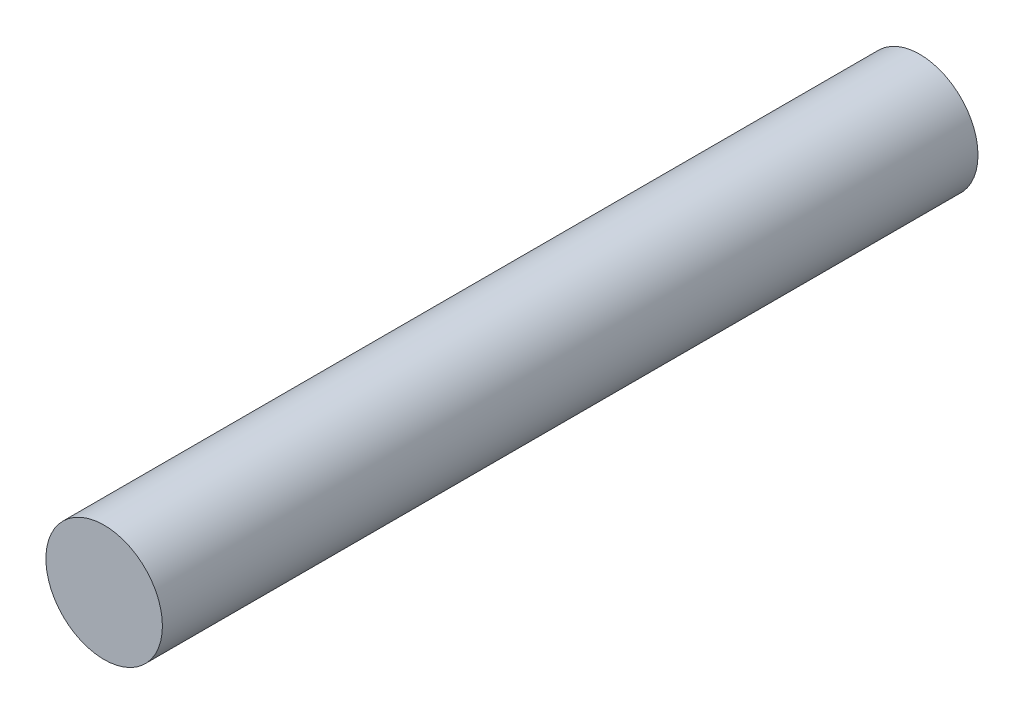
ISO-10303-21;
HEADER;
FILE_DESCRIPTION(('STEP AP214'),'2;1');
FILE_NAME('part.step','',(''),(''),'','','');
FILE_SCHEMA(('AUTOMOTIVE_DESIGN { 1 0 10303 214 1 1 1 1 }'));
ENDSEC;
DATA;
#1=APPLICATION_CONTEXT('core data for automotive mechanical design processes');
#2=APPLICATION_PROTOCOL_DEFINITION('international standard','automotive_design',2000,#1);
#3=PRODUCT_CONTEXT('',#1,'mechanical');
#4=PRODUCT('Part','Part','',(#3));
#5=PRODUCT_RELATED_PRODUCT_CATEGORY('part','',(#4));
#6=PRODUCT_DEFINITION_FORMATION('','',#4);
#7=PRODUCT_DEFINITION_CONTEXT('part definition',#1,'design');
#8=PRODUCT_DEFINITION('design','',#6,#7);
#9=PRODUCT_DEFINITION_SHAPE('','',#8);
#10=(LENGTH_UNIT() NAMED_UNIT(*) SI_UNIT(.MILLI.,.METRE.));
#11=(NAMED_UNIT(*) PLANE_ANGLE_UNIT() SI_UNIT($,.RADIAN.));
#12=(NAMED_UNIT(*) SI_UNIT($,.STERADIAN.) SOLID_ANGLE_UNIT());
#13=UNCERTAINTY_MEASURE_WITH_UNIT(LENGTH_MEASURE(1.E-05),#10,'distance_accuracy_value','');
#14=(GEOMETRIC_REPRESENTATION_CONTEXT(3) GLOBAL_UNCERTAINTY_ASSIGNED_CONTEXT((#13)) GLOBAL_UNIT_ASSIGNED_CONTEXT((#10,
#11,#12)) REPRESENTATION_CONTEXT('',''));
#15=CARTESIAN_POINT('',(0.,0.,0.));
#16=DIRECTION('',(0.,0.,1.));
#17=DIRECTION('',(1.,0.,0.));
#18=AXIS2_PLACEMENT_3D('',#15,#16,#17);
#19=CARTESIAN_POINT('',(0.,0.,350.));
#20=DIRECTION('',(0.,0.,-1.));
#21=DIRECTION('',(-1.,0.,0.));
#22=AXIS2_PLACEMENT_3D('',#19,#20,#21);
#23=CYLINDRICAL_SURFACE('',#22,25.);
#24=CARTESIAN_POINT('',(0.,0.,350.));
#25=DIRECTION('',(0.,0.,1.));
#26=DIRECTION('',(1.,0.,0.));
#27=AXIS2_PLACEMENT_3D('',#24,#25,#26);
#28=CIRCLE('',#27,25.);
#29=CARTESIAN_POINT('',(25.,0.,350.));
#30=VERTEX_POINT('',#29);
#31=EDGE_CURVE('E10',#30,#30,#28,.T.);
#32=ORIENTED_EDGE('',*,*,#31,.F.);
#33=EDGE_LOOP('',(#32));
#34=FACE_BOUND('',#33,.T.);
#35=CARTESIAN_POINT('',(0.,0.,0.));
#36=DIRECTION('',(0.,0.,1.));
#37=DIRECTION('',(1.,0.,0.));
#38=AXIS2_PLACEMENT_3D('',#35,#36,#37);
#39=CIRCLE('',#38,25.);
#40=CARTESIAN_POINT('',(25.,0.,0.));
#41=VERTEX_POINT('',#40);
#42=EDGE_CURVE('E34',#41,#41,#39,.T.);
#43=ORIENTED_EDGE('',*,*,#42,.T.);
#44=EDGE_LOOP('',(#43));
#45=FACE_BOUND('',#44,.T.);
#46=ADVANCED_FACE('F31',(#34,#45),#23,.T.);
#47=CARTESIAN_POINT('',(0.,0.,350.));
#48=DIRECTION('',(0.,0.,1.));
#49=DIRECTION('',(1.,0.,0.));
#50=AXIS2_PLACEMENT_3D('',#47,#48,#49);
#51=PLANE('',#50);
#52=ORIENTED_EDGE('',*,*,#31,.T.);
#53=EDGE_LOOP('',(#52));
#54=FACE_BOUND('',#53,.T.);
#55=ADVANCED_FACE('F46',(#54),#51,.T.);
#56=CARTESIAN_POINT('',(0.,0.,0.));
#57=DIRECTION('',(0.,0.,1.));
#58=DIRECTION('',(1.,0.,0.));
#59=AXIS2_PLACEMENT_3D('',#56,#57,#58);
#60=PLANE('',#59);
#61=ORIENTED_EDGE('',*,*,#42,.F.);
#62=EDGE_LOOP('',(#61));
#63=FACE_BOUND('',#62,.T.);
#64=ADVANCED_FACE('F44',(#63),#60,.F.);
#65=CLOSED_SHELL('',(#46,#55,#64));
#66=MANIFOLD_SOLID_BREP('B2',#65);
#67=ADVANCED_BREP_SHAPE_REPRESENTATION('',(#18,#66),#14);
#68=SHAPE_DEFINITION_REPRESENTATION(#9,#67);
ENDSEC;
END-ISO-10303-21;
